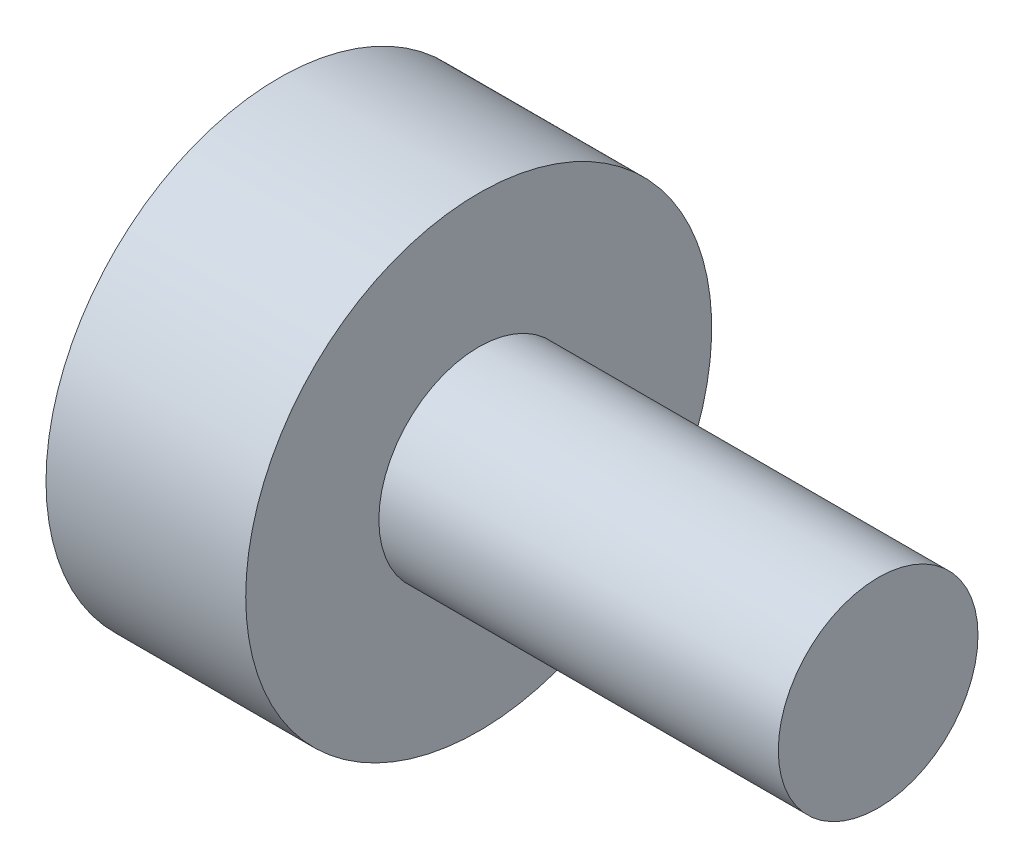
ISO-10303-21;
HEADER;
FILE_DESCRIPTION(('STEP AP214'),'2;1');
FILE_NAME('part.step','',(''),(''),'','','');
FILE_SCHEMA(('AUTOMOTIVE_DESIGN { 1 0 10303 214 1 1 1 1 }'));
ENDSEC;
DATA;
#1=APPLICATION_CONTEXT('core data for automotive mechanical design processes');
#2=APPLICATION_PROTOCOL_DEFINITION('international standard','automotive_design',2000,#1);
#3=PRODUCT_CONTEXT('',#1,'mechanical');
#4=PRODUCT('Part','Part','',(#3));
#5=PRODUCT_RELATED_PRODUCT_CATEGORY('part','',(#4));
#6=PRODUCT_DEFINITION_FORMATION('','',#4);
#7=PRODUCT_DEFINITION_CONTEXT('part definition',#1,'design');
#8=PRODUCT_DEFINITION('design','',#6,#7);
#9=PRODUCT_DEFINITION_SHAPE('','',#8);
#10=(LENGTH_UNIT() NAMED_UNIT(*) SI_UNIT(.MILLI.,.METRE.));
#11=(NAMED_UNIT(*) PLANE_ANGLE_UNIT() SI_UNIT($,.RADIAN.));
#12=(NAMED_UNIT(*) SI_UNIT($,.STERADIAN.) SOLID_ANGLE_UNIT());
#13=UNCERTAINTY_MEASURE_WITH_UNIT(LENGTH_MEASURE(1.E-05),#10,'distance_accuracy_value','');
#14=(GEOMETRIC_REPRESENTATION_CONTEXT(3) GLOBAL_UNCERTAINTY_ASSIGNED_CONTEXT((#13)) GLOBAL_UNIT_ASSIGNED_CONTEXT((#10,
#11,#12)) REPRESENTATION_CONTEXT('',''));
#15=CARTESIAN_POINT('',(0.,0.,0.));
#16=DIRECTION('',(0.,0.,1.));
#17=DIRECTION('',(1.,0.,0.));
#18=AXIS2_PLACEMENT_3D('',#15,#16,#17);
#19=CARTESIAN_POINT('',(0.,0.,0.));
#20=DIRECTION('',(1.,0.,0.));
#21=DIRECTION('',(0.,0.,-1.));
#22=AXIS2_PLACEMENT_3D('',#19,#20,#21);
#23=PLANE('',#22);
#24=CARTESIAN_POINT('',(0.,0.,0.));
#25=DIRECTION('',(-1.,0.,0.));
#26=DIRECTION('',(0.,0.,1.));
#27=AXIS2_PLACEMENT_3D('',#24,#25,#26);
#28=CIRCLE('',#27,20.);
#29=CARTESIAN_POINT('',(0.,0.,20.));
#30=VERTEX_POINT('',#29);
#31=EDGE_CURVE('E10',#30,#30,#28,.T.);
#32=ORIENTED_EDGE('',*,*,#31,.T.);
#33=EDGE_LOOP('',(#32));
#34=FACE_BOUND('',#33,.T.);
#35=ADVANCED_FACE('F38',(#34),#23,.F.);
#36=CARTESIAN_POINT('',(0.,0.,0.));
#37=DIRECTION('',(-1.,0.,0.));
#38=DIRECTION('',(0.,0.,1.));
#39=AXIS2_PLACEMENT_3D('',#36,#37,#38);
#40=CYLINDRICAL_SURFACE('',#39,20.);
#41=ORIENTED_EDGE('',*,*,#31,.F.);
#42=EDGE_LOOP('',(#41));
#43=FACE_BOUND('',#42,.T.);
#44=CARTESIAN_POINT('',(10.,0.,0.));
#45=DIRECTION('',(-1.,0.,0.));
#46=DIRECTION('',(0.,0.,1.));
#47=AXIS2_PLACEMENT_3D('',#44,#45,#46);
#48=CIRCLE('',#47,20.);
#49=CARTESIAN_POINT('',(10.,0.,20.));
#50=VERTEX_POINT('',#49);
#51=EDGE_CURVE('E44',#50,#50,#48,.T.);
#52=ORIENTED_EDGE('',*,*,#51,.T.);
#53=EDGE_LOOP('',(#52));
#54=FACE_BOUND('',#53,.T.);
#55=ADVANCED_FACE('F105',(#43,#54),#40,.T.);
#56=CARTESIAN_POINT('',(10.,20.,0.));
#57=DIRECTION('',(1.,0.,0.));
#58=DIRECTION('',(0.,0.,-1.));
#59=AXIS2_PLACEMENT_3D('',#56,#57,#58);
#60=PLANE('',#59);
#61=ORIENTED_EDGE('',*,*,#51,.F.);
#62=EDGE_LOOP('',(#61));
#63=FACE_BOUND('',#62,.T.);
#64=CARTESIAN_POINT('',(10.,0.,0.));
#65=DIRECTION('',(-1.,0.,0.));
#66=DIRECTION('',(0.,0.,1.));
#67=AXIS2_PLACEMENT_3D('',#64,#65,#66);
#68=CIRCLE('',#67,35.);
#69=CARTESIAN_POINT('',(10.,0.,35.));
#70=VERTEX_POINT('',#69);
#71=EDGE_CURVE('E48',#70,#70,#68,.T.);
#72=ORIENTED_EDGE('',*,*,#71,.T.);
#73=EDGE_LOOP('',(#72));
#74=FACE_BOUND('',#73,.T.);
#75=ADVANCED_FACE('F102',(#63,#74),#60,.F.);
#76=CARTESIAN_POINT('',(0.,0.,0.));
#77=DIRECTION('',(-1.,0.,0.));
#78=DIRECTION('',(0.,0.,1.));
#79=AXIS2_PLACEMENT_3D('',#76,#77,#78);
#80=CYLINDRICAL_SURFACE('',#79,35.);
#81=ORIENTED_EDGE('',*,*,#71,.F.);
#82=EDGE_LOOP('',(#81));
#83=FACE_BOUND('',#82,.T.);
#84=CARTESIAN_POINT('',(40.,0.,0.));
#85=DIRECTION('',(-1.,0.,0.));
#86=DIRECTION('',(0.,0.,1.));
#87=AXIS2_PLACEMENT_3D('',#84,#85,#86);
#88=CIRCLE('',#87,35.);
#89=CARTESIAN_POINT('',(40.,0.,35.));
#90=VERTEX_POINT('',#89);
#91=EDGE_CURVE('E52',#90,#90,#88,.T.);
#92=ORIENTED_EDGE('',*,*,#91,.T.);
#93=EDGE_LOOP('',(#92));
#94=FACE_BOUND('',#93,.T.);
#95=ADVANCED_FACE('F98',(#83,#94),#80,.T.);
#96=CARTESIAN_POINT('',(40.,35.,0.));
#97=DIRECTION('',(-1.,0.,0.));
#98=DIRECTION('',(0.,0.,1.));
#99=AXIS2_PLACEMENT_3D('',#96,#97,#98);
#100=PLANE('',#99);
#101=ORIENTED_EDGE('',*,*,#91,.F.);
#102=EDGE_LOOP('',(#101));
#103=FACE_BOUND('',#102,.T.);
#104=CARTESIAN_POINT('',(40.,0.,0.));
#105=DIRECTION('',(-1.,0.,0.));
#106=DIRECTION('',(0.,0.,1.));
#107=AXIS2_PLACEMENT_3D('',#104,#105,#106);
#108=CIRCLE('',#107,15.);
#109=CARTESIAN_POINT('',(40.,0.,15.));
#110=VERTEX_POINT('',#109);
#111=EDGE_CURVE('E57',#110,#110,#108,.T.);
#112=ORIENTED_EDGE('',*,*,#111,.T.);
#113=EDGE_LOOP('',(#112));
#114=FACE_BOUND('',#113,.T.);
#115=ADVANCED_FACE('F94',(#103,#114),#100,.F.);
#116=CARTESIAN_POINT('',(0.,0.,0.));
#117=DIRECTION('',(-1.,0.,0.));
#118=DIRECTION('',(0.,0.,1.));
#119=AXIS2_PLACEMENT_3D('',#116,#117,#118);
#120=CYLINDRICAL_SURFACE('',#119,15.);
#121=ORIENTED_EDGE('',*,*,#111,.F.);
#122=EDGE_LOOP('',(#121));
#123=FACE_BOUND('',#122,.T.);
#124=CARTESIAN_POINT('',(100.,0.,0.));
#125=DIRECTION('',(-1.,0.,0.));
#126=DIRECTION('',(0.,0.,1.));
#127=AXIS2_PLACEMENT_3D('',#124,#125,#126);
#128=CIRCLE('',#127,15.);
#129=CARTESIAN_POINT('',(100.,0.,15.));
#130=VERTEX_POINT('',#129);
#131=EDGE_CURVE('E60',#130,#130,#128,.T.);
#132=ORIENTED_EDGE('',*,*,#131,.T.);
#133=EDGE_LOOP('',(#132));
#134=FACE_BOUND('',#133,.T.);
#135=ADVANCED_FACE('F90',(#123,#134),#120,.T.);
#136=CARTESIAN_POINT('',(100.,0.,0.));
#137=DIRECTION('',(-1.,0.,0.));
#138=DIRECTION('',(0.,0.,1.));
#139=AXIS2_PLACEMENT_3D('',#136,#137,#138);
#140=PLANE('',#139);
#141=ORIENTED_EDGE('',*,*,#131,.F.);
#142=EDGE_LOOP('',(#141));
#143=FACE_BOUND('',#142,.T.);
#144=ADVANCED_FACE('F87',(#143),#140,.F.);
#145=CLOSED_SHELL('',(#35,#55,#75,#95,#115,#135,#144));
#146=CARTESIAN_POINT('',(45.,0.,0.));
#147=DIRECTION('',(-1.,0.,0.));
#148=DIRECTION('',(0.,0.,1.));
#149=AXIS2_PLACEMENT_3D('',#146,#147,#148);
#150=CYLINDRICAL_SURFACE('',#149,5.);
#151=CARTESIAN_POINT('',(45.,0.,0.));
#152=DIRECTION('',(1.,0.,0.));
#153=DIRECTION('',(0.,0.,-1.));
#154=AXIS2_PLACEMENT_3D('',#151,#152,#153);
#155=CIRCLE('',#154,5.);
#156=CARTESIAN_POINT('',(45.,0.,-5.));
#157=VERTEX_POINT('',#156);
#158=EDGE_CURVE('E63',#157,#157,#155,.T.);
#159=ORIENTED_EDGE('',*,*,#158,.T.);
#160=EDGE_LOOP('',(#159));
#161=FACE_BOUND('',#160,.T.);
#162=CARTESIAN_POINT('',(25.,0.,0.));
#163=DIRECTION('',(1.,0.,0.));
#164=DIRECTION('',(0.,0.,-1.));
#165=AXIS2_PLACEMENT_3D('',#162,#163,#164);
#166=CIRCLE('',#165,5.);
#167=CARTESIAN_POINT('',(25.,0.,-5.));
#168=VERTEX_POINT('',#167);
#169=EDGE_CURVE('E64',#168,#168,#166,.T.);
#170=ORIENTED_EDGE('',*,*,#169,.F.);
#171=EDGE_LOOP('',(#170));
#172=FACE_BOUND('',#171,.T.);
#173=ADVANCED_FACE('F70',(#161,#172),#150,.F.);
#174=CARTESIAN_POINT('',(45.,0.,0.));
#175=DIRECTION('',(1.,0.,0.));
#176=DIRECTION('',(0.,0.,-1.));
#177=AXIS2_PLACEMENT_3D('',#174,#175,#176);
#178=PLANE('',#177);
#179=ORIENTED_EDGE('',*,*,#158,.F.);
#180=EDGE_LOOP('',(#179));
#181=FACE_BOUND('',#180,.T.);
#182=ADVANCED_FACE('F73',(#181),#178,.F.);
#183=CARTESIAN_POINT('',(25.,0.,0.));
#184=DIRECTION('',(1.,0.,0.));
#185=DIRECTION('',(0.,0.,-1.));
#186=AXIS2_PLACEMENT_3D('',#183,#184,#185);
#187=PLANE('',#186);
#188=ORIENTED_EDGE('',*,*,#169,.T.);
#189=EDGE_LOOP('',(#188));
#190=FACE_BOUND('',#189,.T.);
#191=ADVANCED_FACE('F75',(#190),#187,.T.);
#192=CLOSED_SHELL('',(#173,#182,#191));
#193=ORIENTED_CLOSED_SHELL('',*,#192,.T.);
#194=BREP_WITH_VOIDS('B2',#145,(#193));
#195=ADVANCED_BREP_SHAPE_REPRESENTATION('',(#18,#194),#14);
#196=SHAPE_DEFINITION_REPRESENTATION(#9,#195);
ENDSEC;
END-ISO-10303-21;
